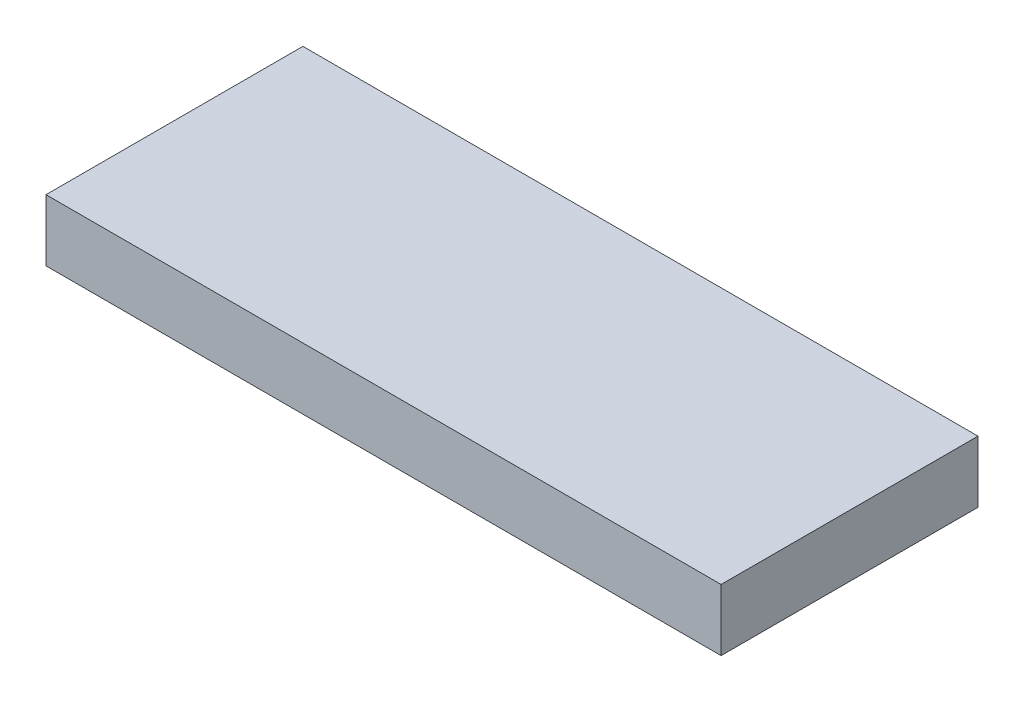
ISO-10303-21;
HEADER;
FILE_DESCRIPTION(('STEP AP214'),'2;1');
FILE_NAME('part.step','',(''),(''),'','','');
FILE_SCHEMA(('AUTOMOTIVE_DESIGN { 1 0 10303 214 1 1 1 1 }'));
ENDSEC;
DATA;
#1=APPLICATION_CONTEXT('core data for automotive mechanical design processes');
#2=APPLICATION_PROTOCOL_DEFINITION('international standard','automotive_design',2000,#1);
#3=PRODUCT_CONTEXT('',#1,'mechanical');
#4=PRODUCT('Part','Part','',(#3));
#5=PRODUCT_RELATED_PRODUCT_CATEGORY('part','',(#4));
#6=PRODUCT_DEFINITION_FORMATION('','',#4);
#7=PRODUCT_DEFINITION_CONTEXT('part definition',#1,'design');
#8=PRODUCT_DEFINITION('design','',#6,#7);
#9=PRODUCT_DEFINITION_SHAPE('','',#8);
#10=(LENGTH_UNIT() NAMED_UNIT(*) SI_UNIT(.MILLI.,.METRE.));
#11=(NAMED_UNIT(*) PLANE_ANGLE_UNIT() SI_UNIT($,.RADIAN.));
#12=(NAMED_UNIT(*) SI_UNIT($,.STERADIAN.) SOLID_ANGLE_UNIT());
#13=UNCERTAINTY_MEASURE_WITH_UNIT(LENGTH_MEASURE(1.E-05),#10,'distance_accuracy_value','');
#14=(GEOMETRIC_REPRESENTATION_CONTEXT(3) GLOBAL_UNCERTAINTY_ASSIGNED_CONTEXT((#13)) GLOBAL_UNIT_ASSIGNED_CONTEXT((#10,
#11,#12)) REPRESENTATION_CONTEXT('',''));
#15=CARTESIAN_POINT('',(0.,0.,0.));
#16=DIRECTION('',(0.,0.,1.));
#17=DIRECTION('',(1.,0.,0.));
#18=AXIS2_PLACEMENT_3D('',#15,#16,#17);
#19=CARTESIAN_POINT('',(-19.71,3.6,15.));
#20=DIRECTION('',(1.,0.,0.));
#21=DIRECTION('',(0.,1.,0.));
#22=AXIS2_PLACEMENT_3D('',#19,#20,#21);
#23=PLANE('',#22);
#24=DIRECTION('',(0.,-1.,0.));
#25=VECTOR('',#24,1.);
#26=CARTESIAN_POINT('',(-19.71,3.6,0.));
#27=LINE('',#26,#25);
#28=CARTESIAN_POINT('',(-19.71,3.6,0.));
#29=VERTEX_POINT('',#28);
#30=CARTESIAN_POINT('',(-19.71,0.,0.));
#31=VERTEX_POINT('',#30);
#32=EDGE_CURVE('E101',#29,#31,#27,.T.);
#33=ORIENTED_EDGE('',*,*,#32,.T.);
#34=DIRECTION('',(0.,0.,-1.));
#35=VECTOR('',#34,1.);
#36=CARTESIAN_POINT('',(-19.71,0.,15.));
#37=LINE('',#36,#35);
#38=CARTESIAN_POINT('',(-19.71,0.,15.));
#39=VERTEX_POINT('',#38);
#40=EDGE_CURVE('E11',#39,#31,#37,.T.);
#41=ORIENTED_EDGE('',*,*,#40,.F.);
#42=DIRECTION('',(0.,-1.,0.));
#43=VECTOR('',#42,1.);
#44=CARTESIAN_POINT('',(-19.71,3.6,15.));
#45=LINE('',#44,#43);
#46=CARTESIAN_POINT('',(-19.71,3.6,15.));
#47=VERTEX_POINT('',#46);
#48=EDGE_CURVE('E89',#47,#39,#45,.T.);
#49=ORIENTED_EDGE('',*,*,#48,.F.);
#50=DIRECTION('',(0.,0.,-1.));
#51=VECTOR('',#50,1.);
#52=CARTESIAN_POINT('',(-19.71,3.6,15.));
#53=LINE('',#52,#51);
#54=EDGE_CURVE('E97',#47,#29,#53,.T.);
#55=ORIENTED_EDGE('',*,*,#54,.T.);
#56=EDGE_LOOP('',(#33,#41,#49,#55));
#57=FACE_BOUND('',#56,.T.);
#58=ADVANCED_FACE('F38',(#57),#23,.F.);
#59=CARTESIAN_POINT('',(-19.71,0.,15.));
#60=DIRECTION('',(0.,1.,0.));
#61=DIRECTION('',(0.,0.,1.));
#62=AXIS2_PLACEMENT_3D('',#59,#60,#61);
#63=PLANE('',#62);
#64=DIRECTION('',(1.,0.,0.));
#65=VECTOR('',#64,1.);
#66=CARTESIAN_POINT('',(-19.71,0.,0.));
#67=LINE('',#66,#65);
#68=CARTESIAN_POINT('',(19.71,0.,0.));
#69=VERTEX_POINT('',#68);
#70=EDGE_CURVE('E93',#31,#69,#67,.T.);
#71=ORIENTED_EDGE('',*,*,#70,.T.);
#72=DIRECTION('',(0.,0.,-1.));
#73=VECTOR('',#72,1.);
#74=CARTESIAN_POINT('',(19.71,0.,15.));
#75=LINE('',#74,#73);
#76=CARTESIAN_POINT('',(19.71,0.,15.));
#77=VERTEX_POINT('',#76);
#78=EDGE_CURVE('E46',#77,#69,#75,.T.);
#79=ORIENTED_EDGE('',*,*,#78,.F.);
#80=DIRECTION('',(1.,0.,0.));
#81=VECTOR('',#80,1.);
#82=CARTESIAN_POINT('',(-19.71,0.,15.));
#83=LINE('',#82,#81);
#84=EDGE_CURVE('E84',#39,#77,#83,.T.);
#85=ORIENTED_EDGE('',*,*,#84,.F.);
#86=ORIENTED_EDGE('',*,*,#40,.T.);
#87=EDGE_LOOP('',(#71,#79,#85,#86));
#88=FACE_BOUND('',#87,.T.);
#89=ADVANCED_FACE('F92',(#88),#63,.F.);
#90=CARTESIAN_POINT('',(19.71,3.6,15.));
#91=DIRECTION('',(-1.,0.,0.));
#92=DIRECTION('',(0.,-1.,0.));
#93=AXIS2_PLACEMENT_3D('',#90,#91,#92);
#94=PLANE('',#93);
#95=DIRECTION('',(0.,1.,0.));
#96=VECTOR('',#95,1.);
#97=CARTESIAN_POINT('',(19.71,3.6,0.));
#98=LINE('',#97,#96);
#99=CARTESIAN_POINT('',(19.71,3.6,0.));
#100=VERTEX_POINT('',#99);
#101=EDGE_CURVE('E71',#69,#100,#98,.T.);
#102=ORIENTED_EDGE('',*,*,#101,.T.);
#103=DIRECTION('',(0.,0.,-1.));
#104=VECTOR('',#103,1.);
#105=CARTESIAN_POINT('',(19.71,3.6,15.));
#106=LINE('',#105,#104);
#107=CARTESIAN_POINT('',(19.71,3.6,15.));
#108=VERTEX_POINT('',#107);
#109=EDGE_CURVE('E94',#108,#100,#106,.T.);
#110=ORIENTED_EDGE('',*,*,#109,.F.);
#111=DIRECTION('',(0.,1.,0.));
#112=VECTOR('',#111,1.);
#113=CARTESIAN_POINT('',(19.71,3.6,15.));
#114=LINE('',#113,#112);
#115=EDGE_CURVE('E87',#77,#108,#114,.T.);
#116=ORIENTED_EDGE('',*,*,#115,.F.);
#117=ORIENTED_EDGE('',*,*,#78,.T.);
#118=EDGE_LOOP('',(#102,#110,#116,#117));
#119=FACE_BOUND('',#118,.T.);
#120=ADVANCED_FACE('F95',(#119),#94,.F.);
#121=CARTESIAN_POINT('',(-19.71,3.6,15.));
#122=DIRECTION('',(0.,-1.,0.));
#123=DIRECTION('',(0.,0.,-1.));
#124=AXIS2_PLACEMENT_3D('',#121,#122,#123);
#125=PLANE('',#124);
#126=DIRECTION('',(-1.,0.,0.));
#127=VECTOR('',#126,1.);
#128=CARTESIAN_POINT('',(-19.71,3.6,0.));
#129=LINE('',#128,#127);
#130=EDGE_CURVE('E77',#100,#29,#129,.T.);
#131=ORIENTED_EDGE('',*,*,#130,.T.);
#132=ORIENTED_EDGE('',*,*,#54,.F.);
#133=DIRECTION('',(-1.,0.,0.));
#134=VECTOR('',#133,1.);
#135=CARTESIAN_POINT('',(-19.71,3.6,15.));
#136=LINE('',#135,#134);
#137=EDGE_CURVE('E54',#108,#47,#136,.T.);
#138=ORIENTED_EDGE('',*,*,#137,.F.);
#139=ORIENTED_EDGE('',*,*,#109,.T.);
#140=EDGE_LOOP('',(#131,#132,#138,#139));
#141=FACE_BOUND('',#140,.T.);
#142=ADVANCED_FACE('F108',(#141),#125,.F.);
#143=CARTESIAN_POINT('',(0.,0.,15.));
#144=DIRECTION('',(0.,0.,1.));
#145=DIRECTION('',(1.,0.,0.));
#146=AXIS2_PLACEMENT_3D('',#143,#144,#145);
#147=PLANE('',#146);
#148=ORIENTED_EDGE('',*,*,#48,.T.);
#149=ORIENTED_EDGE('',*,*,#84,.T.);
#150=ORIENTED_EDGE('',*,*,#115,.T.);
#151=ORIENTED_EDGE('',*,*,#137,.T.);
#152=EDGE_LOOP('',(#148,#149,#150,#151));
#153=FACE_BOUND('',#152,.T.);
#154=ADVANCED_FACE('F85',(#153),#147,.T.);
#155=CARTESIAN_POINT('',(0.,0.,0.));
#156=DIRECTION('',(0.,0.,1.));
#157=DIRECTION('',(1.,0.,0.));
#158=AXIS2_PLACEMENT_3D('',#155,#156,#157);
#159=PLANE('',#158);
#160=ORIENTED_EDGE('',*,*,#32,.F.);
#161=ORIENTED_EDGE('',*,*,#130,.F.);
#162=ORIENTED_EDGE('',*,*,#101,.F.);
#163=ORIENTED_EDGE('',*,*,#70,.F.);
#164=EDGE_LOOP('',(#160,#161,#162,#163));
#165=FACE_BOUND('',#164,.T.);
#166=ADVANCED_FACE('F111',(#165),#159,.F.);
#167=CLOSED_SHELL('',(#58,#89,#120,#142,#154,#166));
#168=MANIFOLD_SOLID_BREP('B2',#167);
#169=ADVANCED_BREP_SHAPE_REPRESENTATION('',(#18,#168),#14);
#170=SHAPE_DEFINITION_REPRESENTATION(#9,#169);
ENDSEC;
END-ISO-10303-21;
